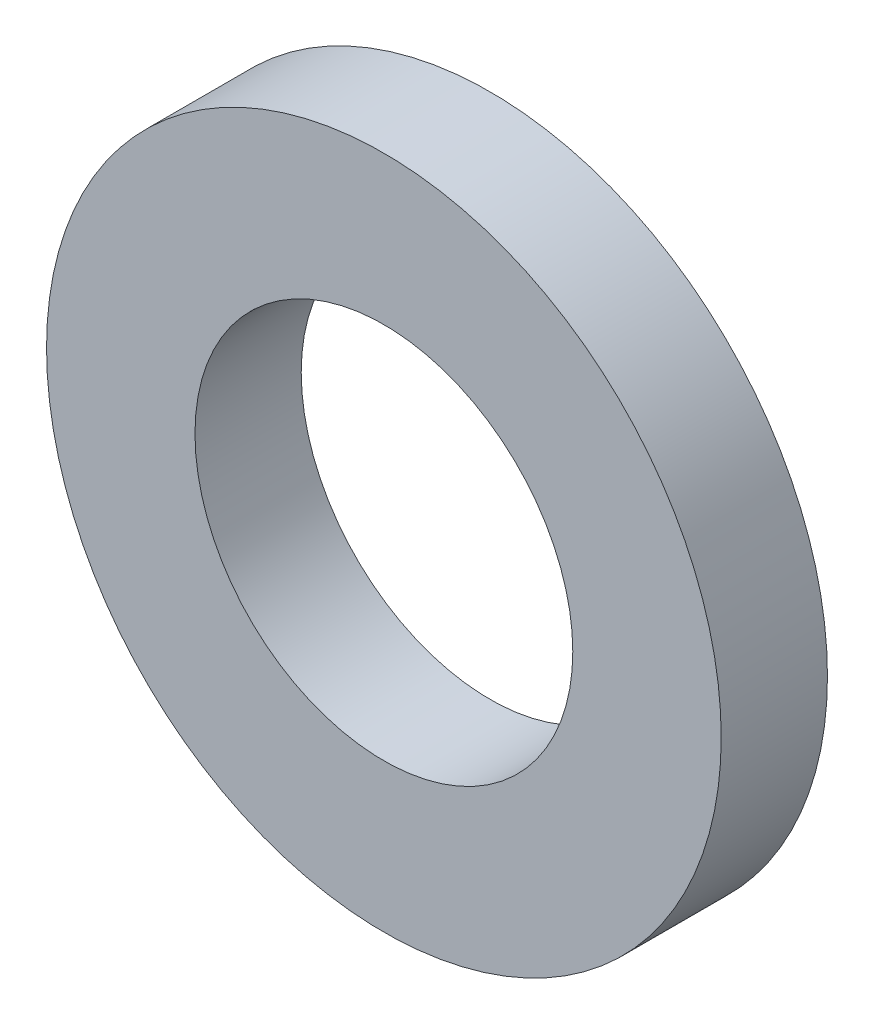
ISO-10303-21;
HEADER;
FILE_DESCRIPTION(('STEP AP214'),'2;1');
FILE_NAME('part.step','',(''),(''),'','','');
FILE_SCHEMA(('AUTOMOTIVE_DESIGN { 1 0 10303 214 1 1 1 1 }'));
ENDSEC;
DATA;
#1=APPLICATION_CONTEXT('core data for automotive mechanical design processes');
#2=APPLICATION_PROTOCOL_DEFINITION('international standard','automotive_design',2000,#1);
#3=PRODUCT_CONTEXT('',#1,'mechanical');
#4=PRODUCT('Part','Part','',(#3));
#5=PRODUCT_RELATED_PRODUCT_CATEGORY('part','',(#4));
#6=PRODUCT_DEFINITION_FORMATION('','',#4);
#7=PRODUCT_DEFINITION_CONTEXT('part definition',#1,'design');
#8=PRODUCT_DEFINITION('design','',#6,#7);
#9=PRODUCT_DEFINITION_SHAPE('','',#8);
#10=(LENGTH_UNIT() NAMED_UNIT(*) SI_UNIT(.MILLI.,.METRE.));
#11=(NAMED_UNIT(*) PLANE_ANGLE_UNIT() SI_UNIT($,.RADIAN.));
#12=(NAMED_UNIT(*) SI_UNIT($,.STERADIAN.) SOLID_ANGLE_UNIT());
#13=UNCERTAINTY_MEASURE_WITH_UNIT(LENGTH_MEASURE(1.E-05),#10,'distance_accuracy_value','');
#14=(GEOMETRIC_REPRESENTATION_CONTEXT(3) GLOBAL_UNCERTAINTY_ASSIGNED_CONTEXT((#13)) GLOBAL_UNIT_ASSIGNED_CONTEXT((#10,
#11,#12)) REPRESENTATION_CONTEXT('',''));
#15=CARTESIAN_POINT('',(0.,0.,0.));
#16=DIRECTION('',(0.,0.,1.));
#17=DIRECTION('',(1.,0.,0.));
#18=AXIS2_PLACEMENT_3D('',#15,#16,#17);
#19=CARTESIAN_POINT('',(0.,0.,0.));
#20=DIRECTION('',(0.,0.,-1.));
#21=DIRECTION('',(1.,0.,0.));
#22=AXIS2_PLACEMENT_3D('',#19,#20,#21);
#23=CYLINDRICAL_SURFACE('',#22,0.635);
#24=CARTESIAN_POINT('',(0.,0.,0.1999996));
#25=DIRECTION('',(0.,0.,1.));
#26=DIRECTION('',(1.,0.,0.));
#27=AXIS2_PLACEMENT_3D('',#24,#25,#26);
#28=CIRCLE('',#27,0.635);
#29=CARTESIAN_POINT('',(0.635,0.,0.1999996));
#30=VERTEX_POINT('',#29);
#31=EDGE_CURVE('E11',#30,#30,#28,.T.);
#32=ORIENTED_EDGE('',*,*,#31,.F.);
#33=DIRECTION('',(0.,0.,1.));
#34=VECTOR('',#33,1.);
#35=CARTESIAN_POINT('',(0.635,0.,0.));
#36=LINE('',#35,#34);
#37=CARTESIAN_POINT('',(0.635,0.,0.));
#38=VERTEX_POINT('',#37);
#39=EDGE_CURVE('E24',#38,#30,#36,.T.);
#40=ORIENTED_EDGE('',*,*,#39,.F.);
#41=CARTESIAN_POINT('',(0.,0.,0.));
#42=DIRECTION('',(0.,0.,1.));
#43=DIRECTION('',(1.,0.,0.));
#44=AXIS2_PLACEMENT_3D('',#41,#42,#43);
#45=CIRCLE('',#44,0.635);
#46=EDGE_CURVE('E46',#38,#38,#45,.T.);
#47=ORIENTED_EDGE('',*,*,#46,.T.);
#48=ORIENTED_EDGE('',*,*,#39,.T.);
#49=EDGE_LOOP('',(#32,#40,#47,#48));
#50=FACE_BOUND('',#49,.T.);
#51=ADVANCED_FACE('F17',(#50),#23,.T.);
#52=CARTESIAN_POINT('',(0.,0.,0.));
#53=DIRECTION('',(0.,0.,-1.));
#54=DIRECTION('',(1.,0.,0.));
#55=AXIS2_PLACEMENT_3D('',#52,#53,#54);
#56=CYLINDRICAL_SURFACE('',#55,0.3556);
#57=DIRECTION('',(0.,0.,1.));
#58=VECTOR('',#57,1.);
#59=CARTESIAN_POINT('',(0.3556,0.,0.));
#60=LINE('',#59,#58);
#61=CARTESIAN_POINT('',(0.3556,0.,0.));
#62=VERTEX_POINT('',#61);
#63=CARTESIAN_POINT('',(0.3556,0.,0.1999996));
#64=VERTEX_POINT('',#63);
#65=EDGE_CURVE('E40',#62,#64,#60,.T.);
#66=ORIENTED_EDGE('',*,*,#65,.T.);
#67=CARTESIAN_POINT('',(0.,0.,0.1999996));
#68=DIRECTION('',(0.,0.,1.));
#69=DIRECTION('',(1.,0.,0.));
#70=AXIS2_PLACEMENT_3D('',#67,#68,#69);
#71=CIRCLE('',#70,0.3556);
#72=EDGE_CURVE('E45',#64,#64,#71,.T.);
#73=ORIENTED_EDGE('',*,*,#72,.T.);
#74=ORIENTED_EDGE('',*,*,#65,.F.);
#75=CARTESIAN_POINT('',(0.,0.,0.));
#76=DIRECTION('',(0.,0.,1.));
#77=DIRECTION('',(1.,0.,0.));
#78=AXIS2_PLACEMENT_3D('',#75,#76,#77);
#79=CIRCLE('',#78,0.3556);
#80=EDGE_CURVE('E43',#62,#62,#79,.T.);
#81=ORIENTED_EDGE('',*,*,#80,.F.);
#82=EDGE_LOOP('',(#66,#73,#74,#81));
#83=FACE_BOUND('',#82,.T.);
#84=ADVANCED_FACE('F42',(#83),#56,.F.);
#85=CARTESIAN_POINT('',(0.635,0.,0.));
#86=DIRECTION('',(0.,0.,-1.));
#87=DIRECTION('',(-1.,0.,0.));
#88=AXIS2_PLACEMENT_3D('',#85,#86,#87);
#89=PLANE('',#88);
#90=ORIENTED_EDGE('',*,*,#46,.F.);
#91=EDGE_LOOP('',(#90));
#92=FACE_BOUND('',#91,.T.);
#93=ORIENTED_EDGE('',*,*,#80,.T.);
#94=EDGE_LOOP('',(#93));
#95=FACE_BOUND('',#94,.T.);
#96=ADVANCED_FACE('F49',(#92,#95),#89,.T.);
#97=CARTESIAN_POINT('',(0.635,0.,0.1999996));
#98=DIRECTION('',(0.,0.,-1.));
#99=DIRECTION('',(-1.,0.,0.));
#100=AXIS2_PLACEMENT_3D('',#97,#98,#99);
#101=PLANE('',#100);
#102=ORIENTED_EDGE('',*,*,#31,.T.);
#103=EDGE_LOOP('',(#102));
#104=FACE_BOUND('',#103,.T.);
#105=ORIENTED_EDGE('',*,*,#72,.F.);
#106=EDGE_LOOP('',(#105));
#107=FACE_BOUND('',#106,.T.);
#108=ADVANCED_FACE('F56',(#104,#107),#101,.F.);
#109=CLOSED_SHELL('',(#51,#84,#96,#108));
#110=MANIFOLD_SOLID_BREP('B1',#109);
#111=ADVANCED_BREP_SHAPE_REPRESENTATION('',(#18,#110),#14);
#112=SHAPE_DEFINITION_REPRESENTATION(#9,#111);
ENDSEC;
END-ISO-10303-21;
